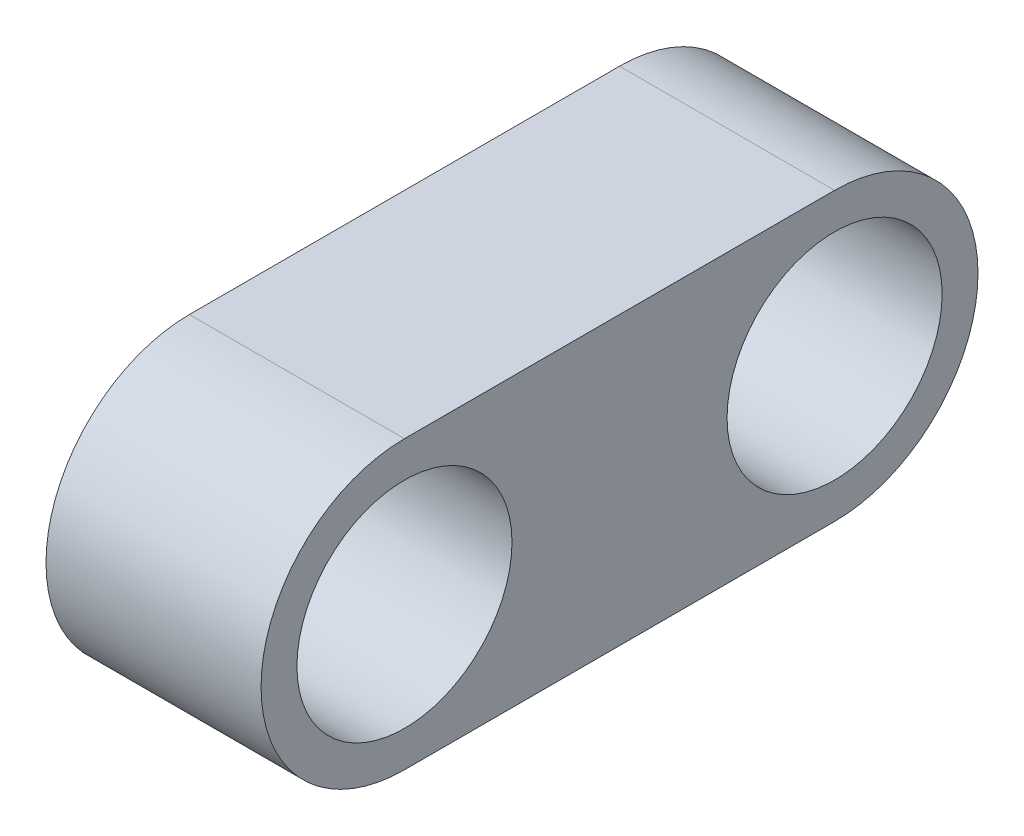
ISO-10303-21;
HEADER;
FILE_DESCRIPTION(('STEP AP214'),'2;1');
FILE_NAME('part.step','',(''),(''),'','','');
FILE_SCHEMA(('AUTOMOTIVE_DESIGN { 1 0 10303 214 1 1 1 1 }'));
ENDSEC;
DATA;
#1=APPLICATION_CONTEXT('core data for automotive mechanical design processes');
#2=APPLICATION_PROTOCOL_DEFINITION('international standard','automotive_design',2000,#1);
#3=PRODUCT_CONTEXT('',#1,'mechanical');
#4=PRODUCT('Part','Part','',(#3));
#5=PRODUCT_RELATED_PRODUCT_CATEGORY('part','',(#4));
#6=PRODUCT_DEFINITION_FORMATION('','',#4);
#7=PRODUCT_DEFINITION_CONTEXT('part definition',#1,'design');
#8=PRODUCT_DEFINITION('design','',#6,#7);
#9=PRODUCT_DEFINITION_SHAPE('','',#8);
#10=(LENGTH_UNIT() NAMED_UNIT(*) SI_UNIT(.MILLI.,.METRE.));
#11=(NAMED_UNIT(*) PLANE_ANGLE_UNIT() SI_UNIT($,.RADIAN.));
#12=(NAMED_UNIT(*) SI_UNIT($,.STERADIAN.) SOLID_ANGLE_UNIT());
#13=UNCERTAINTY_MEASURE_WITH_UNIT(LENGTH_MEASURE(1.E-05),#10,'distance_accuracy_value','');
#14=(GEOMETRIC_REPRESENTATION_CONTEXT(3) GLOBAL_UNCERTAINTY_ASSIGNED_CONTEXT((#13)) GLOBAL_UNIT_ASSIGNED_CONTEXT((#10,
#11,#12)) REPRESENTATION_CONTEXT('',''));
#15=CARTESIAN_POINT('',(0.,0.,0.));
#16=DIRECTION('',(0.,0.,1.));
#17=DIRECTION('',(1.,0.,0.));
#18=AXIS2_PLACEMENT_3D('',#15,#16,#17);
#19=CARTESIAN_POINT('',(3.,-4.,0.));
#20=DIRECTION('',(0.,1.,0.));
#21=DIRECTION('',(0.,0.,1.));
#22=AXIS2_PLACEMENT_3D('',#19,#20,#21);
#23=PLANE('',#22);
#24=DIRECTION('',(0.,0.,-1.));
#25=VECTOR('',#24,1.);
#26=CARTESIAN_POINT('',(0.,-4.,0.));
#27=LINE('',#26,#25);
#28=CARTESIAN_POINT('',(0.,-4.,0.));
#29=VERTEX_POINT('',#28);
#30=CARTESIAN_POINT('',(0.,-4.,-6.));
#31=VERTEX_POINT('',#30);
#32=EDGE_CURVE('E105',#29,#31,#27,.T.);
#33=ORIENTED_EDGE('',*,*,#32,.T.);
#34=DIRECTION('',(-1.,0.,0.));
#35=VECTOR('',#34,1.);
#36=CARTESIAN_POINT('',(3.,-4.,-6.));
#37=LINE('',#36,#35);
#38=CARTESIAN_POINT('',(3.,-4.,-6.));
#39=VERTEX_POINT('',#38);
#40=EDGE_CURVE('E11',#39,#31,#37,.T.);
#41=ORIENTED_EDGE('',*,*,#40,.F.);
#42=DIRECTION('',(0.,0.,-1.));
#43=VECTOR('',#42,1.);
#44=CARTESIAN_POINT('',(3.,-4.,0.));
#45=LINE('',#44,#43);
#46=CARTESIAN_POINT('',(3.,-4.,0.));
#47=VERTEX_POINT('',#46);
#48=EDGE_CURVE('E84',#47,#39,#45,.T.);
#49=ORIENTED_EDGE('',*,*,#48,.F.);
#50=DIRECTION('',(-1.,0.,0.));
#51=VECTOR('',#50,1.);
#52=CARTESIAN_POINT('',(3.,-4.,0.));
#53=LINE('',#52,#51);
#54=EDGE_CURVE('E101',#47,#29,#53,.T.);
#55=ORIENTED_EDGE('',*,*,#54,.T.);
#56=EDGE_LOOP('',(#33,#41,#49,#55));
#57=FACE_BOUND('',#56,.T.);
#58=ADVANCED_FACE('F35',(#57),#23,.F.);
#59=CARTESIAN_POINT('',(3.,-2.,-6.));
#60=DIRECTION('',(-1.,0.,0.));
#61=DIRECTION('',(0.,0.,1.));
#62=AXIS2_PLACEMENT_3D('',#59,#60,#61);
#63=CYLINDRICAL_SURFACE('',#62,2.);
#64=CARTESIAN_POINT('',(0.,-2.,-6.));
#65=DIRECTION('',(1.,0.,0.));
#66=DIRECTION('',(0.,0.,-1.));
#67=AXIS2_PLACEMENT_3D('',#64,#65,#66);
#68=CIRCLE('',#67,2.);
#69=CARTESIAN_POINT('',(0.,0.,-6.));
#70=VERTEX_POINT('',#69);
#71=EDGE_CURVE('E89',#31,#70,#68,.T.);
#72=ORIENTED_EDGE('',*,*,#71,.T.);
#73=DIRECTION('',(-1.,0.,0.));
#74=VECTOR('',#73,1.);
#75=CARTESIAN_POINT('',(3.,0.,-6.));
#76=LINE('',#75,#74);
#77=CARTESIAN_POINT('',(3.,0.,-6.));
#78=VERTEX_POINT('',#77);
#79=EDGE_CURVE('E44',#78,#70,#76,.T.);
#80=ORIENTED_EDGE('',*,*,#79,.F.);
#81=CARTESIAN_POINT('',(3.,-2.,-6.));
#82=DIRECTION('',(1.,0.,0.));
#83=DIRECTION('',(0.,0.,-1.));
#84=AXIS2_PLACEMENT_3D('',#81,#82,#83);
#85=CIRCLE('',#84,2.);
#86=EDGE_CURVE('E78',#39,#78,#85,.T.);
#87=ORIENTED_EDGE('',*,*,#86,.F.);
#88=ORIENTED_EDGE('',*,*,#40,.T.);
#89=EDGE_LOOP('',(#72,#80,#87,#88));
#90=FACE_BOUND('',#89,.T.);
#91=ADVANCED_FACE('F88',(#90),#63,.T.);
#92=CARTESIAN_POINT('',(3.,0.,0.));
#93=DIRECTION('',(0.,1.,0.));
#94=DIRECTION('',(0.,0.,1.));
#95=AXIS2_PLACEMENT_3D('',#92,#93,#94);
#96=PLANE('',#95);
#97=DIRECTION('',(0.,0.,-1.));
#98=VECTOR('',#97,1.);
#99=CARTESIAN_POINT('',(0.,0.,0.));
#100=LINE('',#99,#98);
#101=CARTESIAN_POINT('',(0.,0.,0.));
#102=VERTEX_POINT('',#101);
#103=EDGE_CURVE('E109',#102,#70,#100,.T.);
#104=ORIENTED_EDGE('',*,*,#103,.F.);
#105=DIRECTION('',(-1.,0.,0.));
#106=VECTOR('',#105,1.);
#107=CARTESIAN_POINT('',(3.,0.,0.));
#108=LINE('',#107,#106);
#109=CARTESIAN_POINT('',(3.,0.,0.));
#110=VERTEX_POINT('',#109);
#111=EDGE_CURVE('E68',#110,#102,#108,.T.);
#112=ORIENTED_EDGE('',*,*,#111,.F.);
#113=DIRECTION('',(0.,0.,-1.));
#114=VECTOR('',#113,1.);
#115=CARTESIAN_POINT('',(3.,0.,0.));
#116=LINE('',#115,#114);
#117=EDGE_CURVE('E82',#110,#78,#116,.T.);
#118=ORIENTED_EDGE('',*,*,#117,.T.);
#119=ORIENTED_EDGE('',*,*,#79,.T.);
#120=EDGE_LOOP('',(#104,#112,#118,#119));
#121=FACE_BOUND('',#120,.T.);
#122=ADVANCED_FACE('F93',(#121),#96,.T.);
#123=CARTESIAN_POINT('',(3.,-2.,0.));
#124=DIRECTION('',(-1.,0.,0.));
#125=DIRECTION('',(0.,0.,1.));
#126=AXIS2_PLACEMENT_3D('',#123,#124,#125);
#127=CYLINDRICAL_SURFACE('',#126,2.);
#128=CARTESIAN_POINT('',(0.,-2.,0.));
#129=DIRECTION('',(1.,0.,0.));
#130=DIRECTION('',(0.,0.,-1.));
#131=AXIS2_PLACEMENT_3D('',#128,#129,#130);
#132=CIRCLE('',#131,2.);
#133=EDGE_CURVE('E71',#102,#29,#132,.T.);
#134=ORIENTED_EDGE('',*,*,#133,.T.);
#135=ORIENTED_EDGE('',*,*,#54,.F.);
#136=CARTESIAN_POINT('',(3.,-2.,0.));
#137=DIRECTION('',(1.,0.,0.));
#138=DIRECTION('',(0.,0.,-1.));
#139=AXIS2_PLACEMENT_3D('',#136,#137,#138);
#140=CIRCLE('',#139,2.);
#141=EDGE_CURVE('E52',#110,#47,#140,.T.);
#142=ORIENTED_EDGE('',*,*,#141,.F.);
#143=ORIENTED_EDGE('',*,*,#111,.T.);
#144=EDGE_LOOP('',(#134,#135,#142,#143));
#145=FACE_BOUND('',#144,.T.);
#146=ADVANCED_FACE('F137',(#145),#127,.T.);
#147=CARTESIAN_POINT('',(3.,-2.,0.));
#148=DIRECTION('',(-1.,0.,0.));
#149=DIRECTION('',(0.,0.,1.));
#150=AXIS2_PLACEMENT_3D('',#147,#148,#149);
#151=CYLINDRICAL_SURFACE('',#150,1.5);
#152=CARTESIAN_POINT('',(3.,-2.,0.));
#153=DIRECTION('',(1.,0.,0.));
#154=DIRECTION('',(0.,0.,-1.));
#155=AXIS2_PLACEMENT_3D('',#152,#153,#154);
#156=CIRCLE('',#155,1.5);
#157=CARTESIAN_POINT('',(3.,-2.,-1.5));
#158=VERTEX_POINT('',#157);
#159=EDGE_CURVE('E115',#158,#158,#156,.T.);
#160=ORIENTED_EDGE('',*,*,#159,.T.);
#161=EDGE_LOOP('',(#160));
#162=FACE_BOUND('',#161,.T.);
#163=CARTESIAN_POINT('',(0.,-2.,0.));
#164=DIRECTION('',(1.,0.,0.));
#165=DIRECTION('',(0.,0.,-1.));
#166=AXIS2_PLACEMENT_3D('',#163,#164,#165);
#167=CIRCLE('',#166,1.5);
#168=CARTESIAN_POINT('',(0.,-2.,-1.5));
#169=VERTEX_POINT('',#168);
#170=EDGE_CURVE('E102',#169,#169,#167,.T.);
#171=ORIENTED_EDGE('',*,*,#170,.F.);
#172=EDGE_LOOP('',(#171));
#173=FACE_BOUND('',#172,.T.);
#174=ADVANCED_FACE('F37',(#162,#173),#151,.F.);
#175=CARTESIAN_POINT('',(3.,-2.,-6.));
#176=DIRECTION('',(-1.,0.,0.));
#177=DIRECTION('',(0.,0.,1.));
#178=AXIS2_PLACEMENT_3D('',#175,#176,#177);
#179=CYLINDRICAL_SURFACE('',#178,1.5);
#180=CARTESIAN_POINT('',(3.,-2.,-6.));
#181=DIRECTION('',(1.,0.,0.));
#182=DIRECTION('',(0.,0.,-1.));
#183=AXIS2_PLACEMENT_3D('',#180,#181,#182);
#184=CIRCLE('',#183,1.5);
#185=CARTESIAN_POINT('',(3.,-2.,-7.50000000000001));
#186=VERTEX_POINT('',#185);
#187=EDGE_CURVE('E95',#186,#186,#184,.T.);
#188=ORIENTED_EDGE('',*,*,#187,.T.);
#189=EDGE_LOOP('',(#188));
#190=FACE_BOUND('',#189,.T.);
#191=CARTESIAN_POINT('',(0.,-2.,-6.));
#192=DIRECTION('',(1.,0.,0.));
#193=DIRECTION('',(0.,0.,-1.));
#194=AXIS2_PLACEMENT_3D('',#191,#192,#193);
#195=CIRCLE('',#194,1.5);
#196=CARTESIAN_POINT('',(0.,-2.,-7.50000000000001));
#197=VERTEX_POINT('',#196);
#198=EDGE_CURVE('E112',#197,#197,#195,.T.);
#199=ORIENTED_EDGE('',*,*,#198,.F.);
#200=EDGE_LOOP('',(#199));
#201=FACE_BOUND('',#200,.T.);
#202=ADVANCED_FACE('F127',(#190,#201),#179,.F.);
#203=CARTESIAN_POINT('',(3.,0.,0.));
#204=DIRECTION('',(1.,0.,0.));
#205=DIRECTION('',(0.,0.,-1.));
#206=AXIS2_PLACEMENT_3D('',#203,#204,#205);
#207=PLANE('',#206);
#208=ORIENTED_EDGE('',*,*,#159,.F.);
#209=EDGE_LOOP('',(#208));
#210=FACE_BOUND('',#209,.T.);
#211=ORIENTED_EDGE('',*,*,#48,.T.);
#212=ORIENTED_EDGE('',*,*,#86,.T.);
#213=ORIENTED_EDGE('',*,*,#117,.F.);
#214=ORIENTED_EDGE('',*,*,#141,.T.);
#215=EDGE_LOOP('',(#211,#212,#213,#214));
#216=FACE_BOUND('',#215,.T.);
#217=ORIENTED_EDGE('',*,*,#187,.F.);
#218=EDGE_LOOP('',(#217));
#219=FACE_BOUND('',#218,.T.);
#220=ADVANCED_FACE('F79',(#210,#216,#219),#207,.T.);
#221=CARTESIAN_POINT('',(0.,0.,0.));
#222=DIRECTION('',(1.,0.,0.));
#223=DIRECTION('',(0.,0.,-1.));
#224=AXIS2_PLACEMENT_3D('',#221,#222,#223);
#225=PLANE('',#224);
#226=ORIENTED_EDGE('',*,*,#170,.T.);
#227=EDGE_LOOP('',(#226));
#228=FACE_BOUND('',#227,.T.);
#229=ORIENTED_EDGE('',*,*,#32,.F.);
#230=ORIENTED_EDGE('',*,*,#133,.F.);
#231=ORIENTED_EDGE('',*,*,#103,.T.);
#232=ORIENTED_EDGE('',*,*,#71,.F.);
#233=EDGE_LOOP('',(#229,#230,#231,#232));
#234=FACE_BOUND('',#233,.T.);
#235=ORIENTED_EDGE('',*,*,#198,.T.);
#236=EDGE_LOOP('',(#235));
#237=FACE_BOUND('',#236,.T.);
#238=ADVANCED_FACE('F120',(#228,#234,#237),#225,.F.);
#239=CLOSED_SHELL('',(#58,#91,#122,#146,#174,#202,#220,#238));
#240=MANIFOLD_SOLID_BREP('B2',#239);
#241=ADVANCED_BREP_SHAPE_REPRESENTATION('',(#18,#240),#14);
#242=SHAPE_DEFINITION_REPRESENTATION(#9,#241);
ENDSEC;
END-ISO-10303-21;
